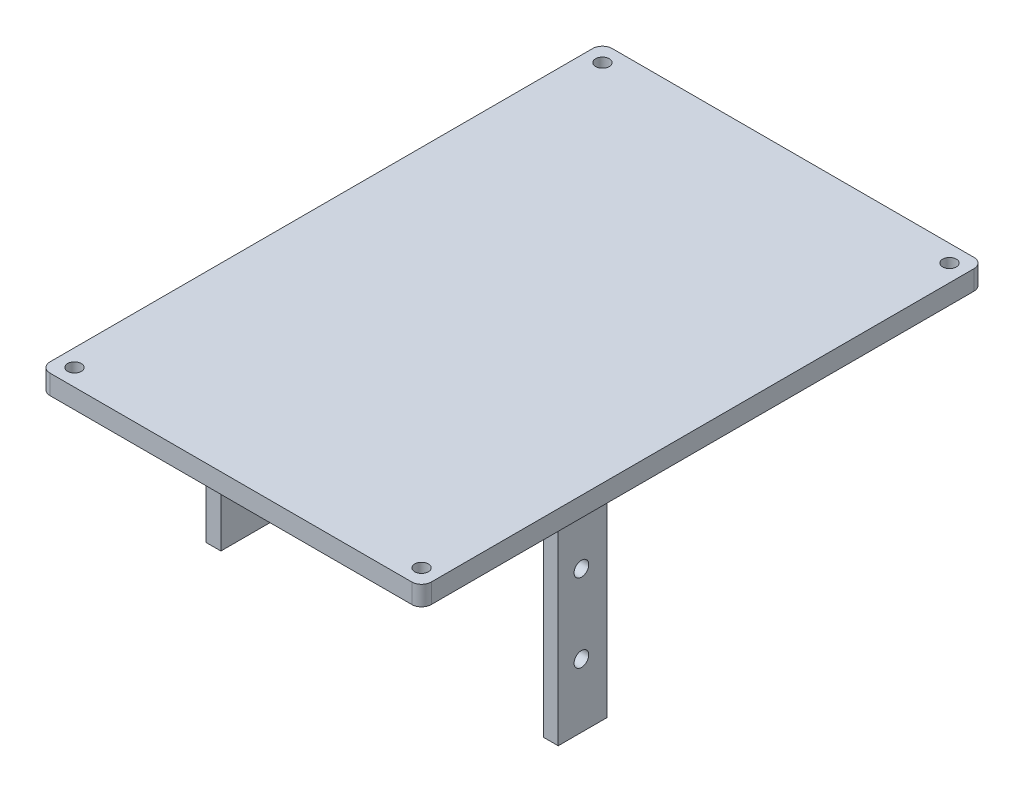
ISO-10303-21;
HEADER;
FILE_DESCRIPTION(('STEP AP214'),'2;1');
FILE_NAME('part.step','',(''),(''),'','','');
FILE_SCHEMA(('AUTOMOTIVE_DESIGN { 1 0 10303 214 1 1 1 1 }'));
ENDSEC;
DATA;
#1=APPLICATION_CONTEXT('core data for automotive mechanical design processes');
#2=APPLICATION_PROTOCOL_DEFINITION('international standard','automotive_design',2000,#1);
#3=PRODUCT_CONTEXT('',#1,'mechanical');
#4=PRODUCT('Part','Part','',(#3));
#5=PRODUCT_RELATED_PRODUCT_CATEGORY('part','',(#4));
#6=PRODUCT_DEFINITION_FORMATION('','',#4);
#7=PRODUCT_DEFINITION_CONTEXT('part definition',#1,'design');
#8=PRODUCT_DEFINITION('design','',#6,#7);
#9=PRODUCT_DEFINITION_SHAPE('','',#8);
#10=(LENGTH_UNIT() NAMED_UNIT(*) SI_UNIT(.MILLI.,.METRE.));
#11=(NAMED_UNIT(*) PLANE_ANGLE_UNIT() SI_UNIT($,.RADIAN.));
#12=(NAMED_UNIT(*) SI_UNIT($,.STERADIAN.) SOLID_ANGLE_UNIT());
#13=UNCERTAINTY_MEASURE_WITH_UNIT(LENGTH_MEASURE(1.E-05),#10,'distance_accuracy_value','');
#14=(GEOMETRIC_REPRESENTATION_CONTEXT(3) GLOBAL_UNCERTAINTY_ASSIGNED_CONTEXT((#13)) GLOBAL_UNIT_ASSIGNED_CONTEXT((#10,
#11,#12)) REPRESENTATION_CONTEXT('',''));
#15=CARTESIAN_POINT('',(0.,0.,0.));
#16=DIRECTION('',(0.,0.,1.));
#17=DIRECTION('',(1.,0.,0.));
#18=AXIS2_PLACEMENT_3D('',#15,#16,#17);
#19=CARTESIAN_POINT('',(0.,0.,0.));
#20=DIRECTION('',(0.,1.,0.));
#21=DIRECTION('',(0.,0.,1.));
#22=AXIS2_PLACEMENT_3D('',#19,#20,#21);
#23=PLANE('',#22);
#24=DIRECTION('',(0.,0.,-1.));
#25=VECTOR('',#24,1.);
#26=CARTESIAN_POINT('',(-36.,0.,26.55));
#27=LINE('',#26,#25);
#28=CARTESIAN_POINT('',(-36.,0.,26.55));
#29=VERTEX_POINT('',#28);
#30=CARTESIAN_POINT('',(-36.,0.,16.55));
#31=VERTEX_POINT('',#30);
#32=EDGE_CURVE('E172',#29,#31,#27,.T.);
#33=ORIENTED_EDGE('',*,*,#32,.F.);
#34=DIRECTION('',(-1.,0.,0.));
#35=VECTOR('',#34,1.);
#36=CARTESIAN_POINT('',(-36.,0.,26.55));
#37=LINE('',#36,#35);
#38=CARTESIAN_POINT('',(-33.,0.,26.55));
#39=VERTEX_POINT('',#38);
#40=EDGE_CURVE('E185',#39,#29,#37,.T.);
#41=ORIENTED_EDGE('',*,*,#40,.F.);
#42=DIRECTION('',(0.,0.,1.));
#43=VECTOR('',#42,1.);
#44=CARTESIAN_POINT('',(-33.,0.,26.55));
#45=LINE('',#44,#43);
#46=CARTESIAN_POINT('',(-33.,0.,16.55));
#47=VERTEX_POINT('',#46);
#48=EDGE_CURVE('E194',#47,#39,#45,.T.);
#49=ORIENTED_EDGE('',*,*,#48,.F.);
#50=DIRECTION('',(1.,0.,0.));
#51=VECTOR('',#50,1.);
#52=CARTESIAN_POINT('',(-36.,0.,16.55));
#53=LINE('',#52,#51);
#54=EDGE_CURVE('E175',#31,#47,#53,.T.);
#55=ORIENTED_EDGE('',*,*,#54,.F.);
#56=EDGE_LOOP('',(#33,#41,#49,#55));
#57=FACE_BOUND('',#56,.T.);
#58=DIRECTION('',(0.,0.,1.));
#59=VECTOR('',#58,1.);
#60=CARTESIAN_POINT('',(-39.,0.,57.5));
#61=LINE('',#60,#59);
#62=CARTESIAN_POINT('',(-39.,0.,-55.5));
#63=VERTEX_POINT('',#62);
#64=CARTESIAN_POINT('',(-39.,0.,55.5));
#65=VERTEX_POINT('',#64);
#66=EDGE_CURVE('E232',#63,#65,#61,.T.);
#67=ORIENTED_EDGE('',*,*,#66,.F.);
#68=CARTESIAN_POINT('',(-37.,0.,-55.5));
#69=DIRECTION('',(0.,1.,0.));
#70=DIRECTION('',(0.,0.,1.));
#71=AXIS2_PLACEMENT_3D('',#68,#69,#70);
#72=CIRCLE('',#71,2.);
#73=CARTESIAN_POINT('',(-37.,0.,-57.5));
#74=VERTEX_POINT('',#73);
#75=EDGE_CURVE('E266',#63,#74,#72,.F.);
#76=ORIENTED_EDGE('',*,*,#75,.T.);
#77=DIRECTION('',(-1.,0.,0.));
#78=VECTOR('',#77,1.);
#79=CARTESIAN_POINT('',(39.,0.,-57.5));
#80=LINE('',#79,#78);
#81=CARTESIAN_POINT('',(37.,0.,-57.5));
#82=VERTEX_POINT('',#81);
#83=EDGE_CURVE('E239',#82,#74,#80,.T.);
#84=ORIENTED_EDGE('',*,*,#83,.F.);
#85=CARTESIAN_POINT('',(37.,0.,-55.5));
#86=DIRECTION('',(0.,1.,0.));
#87=DIRECTION('',(0.,0.,1.));
#88=AXIS2_PLACEMENT_3D('',#85,#86,#87);
#89=CIRCLE('',#88,2.);
#90=CARTESIAN_POINT('',(39.,0.,-55.5));
#91=VERTEX_POINT('',#90);
#92=EDGE_CURVE('E260',#82,#91,#89,.F.);
#93=ORIENTED_EDGE('',*,*,#92,.T.);
#94=DIRECTION('',(0.,0.,-1.));
#95=VECTOR('',#94,1.);
#96=CARTESIAN_POINT('',(39.,0.,57.5));
#97=LINE('',#96,#95);
#98=CARTESIAN_POINT('',(39.,0.,55.5));
#99=VERTEX_POINT('',#98);
#100=EDGE_CURVE('E252',#99,#91,#97,.T.);
#101=ORIENTED_EDGE('',*,*,#100,.F.);
#102=CARTESIAN_POINT('',(37.,0.,55.5));
#103=DIRECTION('',(0.,1.,0.));
#104=DIRECTION('',(0.,0.,1.));
#105=AXIS2_PLACEMENT_3D('',#102,#103,#104);
#106=CIRCLE('',#105,2.);
#107=CARTESIAN_POINT('',(37.,0.,57.5));
#108=VERTEX_POINT('',#107);
#109=EDGE_CURVE('E262',#99,#108,#106,.F.);
#110=ORIENTED_EDGE('',*,*,#109,.T.);
#111=DIRECTION('',(1.,0.,0.));
#112=VECTOR('',#111,1.);
#113=CARTESIAN_POINT('',(39.,0.,57.5));
#114=LINE('',#113,#112);
#115=CARTESIAN_POINT('',(-37.,0.,57.5));
#116=VERTEX_POINT('',#115);
#117=EDGE_CURVE('E249',#116,#108,#114,.T.);
#118=ORIENTED_EDGE('',*,*,#117,.F.);
#119=CARTESIAN_POINT('',(-37.,0.,55.5));
#120=DIRECTION('',(0.,1.,0.));
#121=DIRECTION('',(0.,0.,1.));
#122=AXIS2_PLACEMENT_3D('',#119,#120,#121);
#123=CIRCLE('',#122,2.);
#124=EDGE_CURVE('E264',#116,#65,#123,.F.);
#125=ORIENTED_EDGE('',*,*,#124,.T.);
#126=EDGE_LOOP('',(#67,#76,#84,#93,#101,#110,#118,#125));
#127=FACE_BOUND('',#126,.T.);
#128=DIRECTION('',(-1.,0.,0.));
#129=VECTOR('',#128,1.);
#130=CARTESIAN_POINT('',(36.,0.,26.55));
#131=LINE('',#130,#129);
#132=CARTESIAN_POINT('',(36.,0.,26.55));
#133=VERTEX_POINT('',#132);
#134=CARTESIAN_POINT('',(33.,0.,26.55));
#135=VERTEX_POINT('',#134);
#136=EDGE_CURVE('E171',#133,#135,#131,.T.);
#137=ORIENTED_EDGE('',*,*,#136,.F.);
#138=DIRECTION('',(0.,0.,1.));
#139=VECTOR('',#138,1.);
#140=CARTESIAN_POINT('',(36.,0.,26.55));
#141=LINE('',#140,#139);
#142=CARTESIAN_POINT('',(36.,0.,16.55));
#143=VERTEX_POINT('',#142);
#144=EDGE_CURVE('E168',#143,#133,#141,.T.);
#145=ORIENTED_EDGE('',*,*,#144,.F.);
#146=DIRECTION('',(1.,0.,0.));
#147=VECTOR('',#146,1.);
#148=CARTESIAN_POINT('',(36.,0.,16.55));
#149=LINE('',#148,#147);
#150=CARTESIAN_POINT('',(33.,0.,16.55));
#151=VERTEX_POINT('',#150);
#152=EDGE_CURVE('E629',#151,#143,#149,.T.);
#153=ORIENTED_EDGE('',*,*,#152,.F.);
#154=DIRECTION('',(0.,0.,-1.));
#155=VECTOR('',#154,1.);
#156=CARTESIAN_POINT('',(33.,0.,26.55));
#157=LINE('',#156,#155);
#158=EDGE_CURVE('E619',#135,#151,#157,.T.);
#159=ORIENTED_EDGE('',*,*,#158,.F.);
#160=EDGE_LOOP('',(#137,#145,#153,#159));
#161=FACE_BOUND('',#160,.T.);
#162=ADVANCED_FACE('F33',(#57,#127,#161),#23,.F.);
#163=CARTESIAN_POINT('',(-39.,4.,57.5));
#164=DIRECTION('',(1.,0.,0.));
#165=DIRECTION('',(0.,0.,-1.));
#166=AXIS2_PLACEMENT_3D('',#163,#164,#165);
#167=PLANE('',#166);
#168=DIRECTION('',(0.,0.,1.));
#169=VECTOR('',#168,1.);
#170=CARTESIAN_POINT('',(-39.,4.,57.5));
#171=LINE('',#170,#169);
#172=CARTESIAN_POINT('',(-39.,4.,-55.5));
#173=VERTEX_POINT('',#172);
#174=CARTESIAN_POINT('',(-39.,4.,55.5));
#175=VERTEX_POINT('',#174);
#176=EDGE_CURVE('E235',#173,#175,#171,.T.);
#177=ORIENTED_EDGE('',*,*,#176,.F.);
#178=DIRECTION('',(0.,-1.,0.));
#179=VECTOR('',#178,1.);
#180=CARTESIAN_POINT('',(-39.,4.,-55.5));
#181=LINE('',#180,#179);
#182=EDGE_CURVE('E257',#173,#63,#181,.T.);
#183=ORIENTED_EDGE('',*,*,#182,.T.);
#184=ORIENTED_EDGE('',*,*,#66,.T.);
#185=DIRECTION('',(0.,-1.,0.));
#186=VECTOR('',#185,1.);
#187=CARTESIAN_POINT('',(-39.,4.,55.5));
#188=LINE('',#187,#186);
#189=EDGE_CURVE('E246',#65,#175,#188,.F.);
#190=ORIENTED_EDGE('',*,*,#189,.T.);
#191=EDGE_LOOP('',(#177,#183,#184,#190));
#192=FACE_BOUND('',#191,.T.);
#193=ADVANCED_FACE('F315',(#192),#167,.F.);
#194=CARTESIAN_POINT('',(39.,4.,57.5));
#195=DIRECTION('',(0.,0.,-1.));
#196=DIRECTION('',(-1.,0.,0.));
#197=AXIS2_PLACEMENT_3D('',#194,#195,#196);
#198=PLANE('',#197);
#199=DIRECTION('',(1.,0.,0.));
#200=VECTOR('',#199,1.);
#201=CARTESIAN_POINT('',(39.,4.,57.5));
#202=LINE('',#201,#200);
#203=CARTESIAN_POINT('',(-37.,4.,57.5));
#204=VERTEX_POINT('',#203);
#205=CARTESIAN_POINT('',(37.,4.,57.5));
#206=VERTEX_POINT('',#205);
#207=EDGE_CURVE('E238',#204,#206,#202,.T.);
#208=ORIENTED_EDGE('',*,*,#207,.F.);
#209=DIRECTION('',(0.,-1.,0.));
#210=VECTOR('',#209,1.);
#211=CARTESIAN_POINT('',(-37.,4.,57.5));
#212=LINE('',#211,#210);
#213=EDGE_CURVE('E282',#204,#116,#212,.T.);
#214=ORIENTED_EDGE('',*,*,#213,.T.);
#215=ORIENTED_EDGE('',*,*,#117,.T.);
#216=DIRECTION('',(0.,-1.,0.));
#217=VECTOR('',#216,1.);
#218=CARTESIAN_POINT('',(37.,4.,57.5));
#219=LINE('',#218,#217);
#220=EDGE_CURVE('E280',#108,#206,#219,.F.);
#221=ORIENTED_EDGE('',*,*,#220,.T.);
#222=EDGE_LOOP('',(#208,#214,#215,#221));
#223=FACE_BOUND('',#222,.T.);
#224=ADVANCED_FACE('F288',(#223),#198,.F.);
#225=CARTESIAN_POINT('',(39.,4.,57.5));
#226=DIRECTION('',(-1.,0.,0.));
#227=DIRECTION('',(0.,0.,1.));
#228=AXIS2_PLACEMENT_3D('',#225,#226,#227);
#229=PLANE('',#228);
#230=DIRECTION('',(0.,0.,-1.));
#231=VECTOR('',#230,1.);
#232=CARTESIAN_POINT('',(39.,4.,57.5));
#233=LINE('',#232,#231);
#234=CARTESIAN_POINT('',(39.,4.,55.5));
#235=VERTEX_POINT('',#234);
#236=CARTESIAN_POINT('',(39.,4.,-55.5));
#237=VERTEX_POINT('',#236);
#238=EDGE_CURVE('E241',#235,#237,#233,.T.);
#239=ORIENTED_EDGE('',*,*,#238,.F.);
#240=DIRECTION('',(0.,-1.,0.));
#241=VECTOR('',#240,1.);
#242=CARTESIAN_POINT('',(39.,4.,55.5));
#243=LINE('',#242,#241);
#244=EDGE_CURVE('E11',#235,#99,#243,.T.);
#245=ORIENTED_EDGE('',*,*,#244,.T.);
#246=ORIENTED_EDGE('',*,*,#100,.T.);
#247=DIRECTION('',(0.,-1.,0.));
#248=VECTOR('',#247,1.);
#249=CARTESIAN_POINT('',(39.,4.,-55.5));
#250=LINE('',#249,#248);
#251=EDGE_CURVE('E41',#91,#237,#250,.F.);
#252=ORIENTED_EDGE('',*,*,#251,.T.);
#253=EDGE_LOOP('',(#239,#245,#246,#252));
#254=FACE_BOUND('',#253,.T.);
#255=ADVANCED_FACE('F299',(#254),#229,.F.);
#256=CARTESIAN_POINT('',(39.,4.,-57.5));
#257=DIRECTION('',(0.,0.,1.));
#258=DIRECTION('',(1.,0.,0.));
#259=AXIS2_PLACEMENT_3D('',#256,#257,#258);
#260=PLANE('',#259);
#261=ORIENTED_EDGE('',*,*,#83,.T.);
#262=DIRECTION('',(0.,-1.,0.));
#263=VECTOR('',#262,1.);
#264=CARTESIAN_POINT('',(-37.,4.,-57.5));
#265=LINE('',#264,#263);
#266=CARTESIAN_POINT('',(-37.,4.,-57.5));
#267=VERTEX_POINT('',#266);
#268=EDGE_CURVE('E271',#74,#267,#265,.F.);
#269=ORIENTED_EDGE('',*,*,#268,.T.);
#270=DIRECTION('',(-1.,0.,0.));
#271=VECTOR('',#270,1.);
#272=CARTESIAN_POINT('',(39.,4.,-57.5));
#273=LINE('',#272,#271);
#274=CARTESIAN_POINT('',(37.,4.,-57.5));
#275=VERTEX_POINT('',#274);
#276=EDGE_CURVE('E243',#275,#267,#273,.T.);
#277=ORIENTED_EDGE('',*,*,#276,.F.);
#278=DIRECTION('',(0.,-1.,0.));
#279=VECTOR('',#278,1.);
#280=CARTESIAN_POINT('',(37.,4.,-57.5));
#281=LINE('',#280,#279);
#282=EDGE_CURVE('E268',#275,#82,#281,.T.);
#283=ORIENTED_EDGE('',*,*,#282,.T.);
#284=EDGE_LOOP('',(#261,#269,#277,#283));
#285=FACE_BOUND('',#284,.T.);
#286=ADVANCED_FACE('F307',(#285),#260,.F.);
#287=CARTESIAN_POINT('',(0.,4.,0.));
#288=DIRECTION('',(0.,1.,0.));
#289=DIRECTION('',(0.,0.,1.));
#290=AXIS2_PLACEMENT_3D('',#287,#288,#289);
#291=PLANE('',#290);
#292=CARTESIAN_POINT('',(-35.5,4.,54.));
#293=DIRECTION('',(0.,1.,0.));
#294=DIRECTION('',(0.,0.,-1.));
#295=AXIS2_PLACEMENT_3D('',#292,#293,#294);
#296=CIRCLE('',#295,1.4);
#297=CARTESIAN_POINT('',(-35.5,4.,52.6));
#298=VERTEX_POINT('',#297);
#299=EDGE_CURVE('E210',#298,#298,#296,.T.);
#300=ORIENTED_EDGE('',*,*,#299,.F.);
#301=EDGE_LOOP('',(#300));
#302=FACE_BOUND('',#301,.T.);
#303=CARTESIAN_POINT('',(35.5,4.,54.));
#304=DIRECTION('',(0.,1.,0.));
#305=DIRECTION('',(0.,0.,-1.));
#306=AXIS2_PLACEMENT_3D('',#303,#304,#305);
#307=CIRCLE('',#306,1.4);
#308=CARTESIAN_POINT('',(35.5,4.,52.6));
#309=VERTEX_POINT('',#308);
#310=EDGE_CURVE('E221',#309,#309,#307,.T.);
#311=ORIENTED_EDGE('',*,*,#310,.F.);
#312=EDGE_LOOP('',(#311));
#313=FACE_BOUND('',#312,.T.);
#314=CARTESIAN_POINT('',(35.5,4.,-54.));
#315=DIRECTION('',(0.,1.,0.));
#316=DIRECTION('',(0.,0.,1.));
#317=AXIS2_PLACEMENT_3D('',#314,#315,#316);
#318=CIRCLE('',#317,1.4);
#319=CARTESIAN_POINT('',(35.5,4.,-52.6));
#320=VERTEX_POINT('',#319);
#321=EDGE_CURVE('E215',#320,#320,#318,.T.);
#322=ORIENTED_EDGE('',*,*,#321,.F.);
#323=EDGE_LOOP('',(#322));
#324=FACE_BOUND('',#323,.T.);
#325=CARTESIAN_POINT('',(-35.5,4.,-54.));
#326=DIRECTION('',(0.,1.,0.));
#327=DIRECTION('',(0.,0.,1.));
#328=AXIS2_PLACEMENT_3D('',#325,#326,#327);
#329=CIRCLE('',#328,1.4);
#330=CARTESIAN_POINT('',(-35.5,4.,-52.6));
#331=VERTEX_POINT('',#330);
#332=EDGE_CURVE('E214',#331,#331,#329,.T.);
#333=ORIENTED_EDGE('',*,*,#332,.F.);
#334=EDGE_LOOP('',(#333));
#335=FACE_BOUND('',#334,.T.);
#336=ORIENTED_EDGE('',*,*,#276,.T.);
#337=CARTESIAN_POINT('',(-37.,4.,-55.5));
#338=DIRECTION('',(0.,1.,0.));
#339=DIRECTION('',(0.,0.,1.));
#340=AXIS2_PLACEMENT_3D('',#337,#338,#339);
#341=CIRCLE('',#340,2.);
#342=EDGE_CURVE('E278',#267,#173,#341,.T.);
#343=ORIENTED_EDGE('',*,*,#342,.T.);
#344=ORIENTED_EDGE('',*,*,#176,.T.);
#345=CARTESIAN_POINT('',(-37.,4.,55.5));
#346=DIRECTION('',(0.,1.,0.));
#347=DIRECTION('',(0.,0.,1.));
#348=AXIS2_PLACEMENT_3D('',#345,#346,#347);
#349=CIRCLE('',#348,2.);
#350=EDGE_CURVE('E276',#175,#204,#349,.T.);
#351=ORIENTED_EDGE('',*,*,#350,.T.);
#352=ORIENTED_EDGE('',*,*,#207,.T.);
#353=CARTESIAN_POINT('',(37.,4.,55.5));
#354=DIRECTION('',(0.,1.,0.));
#355=DIRECTION('',(0.,0.,1.));
#356=AXIS2_PLACEMENT_3D('',#353,#354,#355);
#357=CIRCLE('',#356,2.);
#358=EDGE_CURVE('E54',#206,#235,#357,.T.);
#359=ORIENTED_EDGE('',*,*,#358,.T.);
#360=ORIENTED_EDGE('',*,*,#238,.T.);
#361=CARTESIAN_POINT('',(37.,4.,-55.5));
#362=DIRECTION('',(0.,1.,0.));
#363=DIRECTION('',(0.,0.,1.));
#364=AXIS2_PLACEMENT_3D('',#361,#362,#363);
#365=CIRCLE('',#364,2.);
#366=EDGE_CURVE('E273',#237,#275,#365,.T.);
#367=ORIENTED_EDGE('',*,*,#366,.T.);
#368=EDGE_LOOP('',(#336,#343,#344,#351,#352,#359,#360,#367));
#369=FACE_BOUND('',#368,.T.);
#370=ADVANCED_FACE('F301',(#302,#313,#324,#335,#369),#291,.T.);
#371=CARTESIAN_POINT('',(-35.5,2.,-54.));
#372=DIRECTION('',(0.,1.,0.));
#373=DIRECTION('',(0.,0.,1.));
#374=AXIS2_PLACEMENT_3D('',#371,#372,#373);
#375=CYLINDRICAL_SURFACE('',#374,1.4);
#376=CARTESIAN_POINT('',(-35.5,2.,-54.));
#377=DIRECTION('',(0.,1.,0.));
#378=DIRECTION('',(0.,0.,1.));
#379=AXIS2_PLACEMENT_3D('',#376,#377,#378);
#380=CIRCLE('',#379,1.4);
#381=CARTESIAN_POINT('',(-35.5,2.,-52.6));
#382=VERTEX_POINT('',#381);
#383=EDGE_CURVE('E229',#382,#382,#380,.T.);
#384=ORIENTED_EDGE('',*,*,#383,.F.);
#385=EDGE_LOOP('',(#384));
#386=FACE_BOUND('',#385,.T.);
#387=ORIENTED_EDGE('',*,*,#332,.T.);
#388=EDGE_LOOP('',(#387));
#389=FACE_BOUND('',#388,.T.);
#390=ADVANCED_FACE('F359',(#386,#389),#375,.F.);
#391=CARTESIAN_POINT('',(-35.5,2.,-54.));
#392=DIRECTION('',(0.,1.,0.));
#393=DIRECTION('',(0.,0.,1.));
#394=AXIS2_PLACEMENT_3D('',#391,#392,#393);
#395=PLANE('',#394);
#396=ORIENTED_EDGE('',*,*,#383,.T.);
#397=EDGE_LOOP('',(#396));
#398=FACE_BOUND('',#397,.T.);
#399=ADVANCED_FACE('F367',(#398),#395,.T.);
#400=CARTESIAN_POINT('',(35.5,2.,-54.));
#401=DIRECTION('',(0.,1.,0.));
#402=DIRECTION('',(0.,0.,1.));
#403=AXIS2_PLACEMENT_3D('',#400,#401,#402);
#404=CYLINDRICAL_SURFACE('',#403,1.4);
#405=CARTESIAN_POINT('',(35.5,2.,-54.));
#406=DIRECTION('',(0.,1.,0.));
#407=DIRECTION('',(0.,0.,1.));
#408=AXIS2_PLACEMENT_3D('',#405,#406,#407);
#409=CIRCLE('',#408,1.4);
#410=CARTESIAN_POINT('',(35.5,2.,-52.6));
#411=VERTEX_POINT('',#410);
#412=EDGE_CURVE('E211',#411,#411,#409,.T.);
#413=ORIENTED_EDGE('',*,*,#412,.F.);
#414=EDGE_LOOP('',(#413));
#415=FACE_BOUND('',#414,.T.);
#416=ORIENTED_EDGE('',*,*,#321,.T.);
#417=EDGE_LOOP('',(#416));
#418=FACE_BOUND('',#417,.T.);
#419=ADVANCED_FACE('F374',(#415,#418),#404,.F.);
#420=CARTESIAN_POINT('',(35.5,2.,-54.));
#421=DIRECTION('',(0.,1.,0.));
#422=DIRECTION('',(0.,0.,1.));
#423=AXIS2_PLACEMENT_3D('',#420,#421,#422);
#424=PLANE('',#423);
#425=ORIENTED_EDGE('',*,*,#412,.T.);
#426=EDGE_LOOP('',(#425));
#427=FACE_BOUND('',#426,.T.);
#428=ADVANCED_FACE('F382',(#427),#424,.T.);
#429=CARTESIAN_POINT('',(35.5,2.,54.));
#430=DIRECTION('',(0.,1.,0.));
#431=DIRECTION('',(0.,0.,1.));
#432=AXIS2_PLACEMENT_3D('',#429,#430,#431);
#433=CYLINDRICAL_SURFACE('',#432,1.4);
#434=CARTESIAN_POINT('',(35.5,2.,54.));
#435=DIRECTION('',(0.,1.,0.));
#436=DIRECTION('',(0.,0.,-1.));
#437=AXIS2_PLACEMENT_3D('',#434,#435,#436);
#438=CIRCLE('',#437,1.4);
#439=CARTESIAN_POINT('',(35.5,2.,52.6));
#440=VERTEX_POINT('',#439);
#441=EDGE_CURVE('E218',#440,#440,#438,.T.);
#442=ORIENTED_EDGE('',*,*,#441,.F.);
#443=EDGE_LOOP('',(#442));
#444=FACE_BOUND('',#443,.T.);
#445=ORIENTED_EDGE('',*,*,#310,.T.);
#446=EDGE_LOOP('',(#445));
#447=FACE_BOUND('',#446,.T.);
#448=ADVANCED_FACE('F390',(#444,#447),#433,.F.);
#449=CARTESIAN_POINT('',(35.5,2.,54.));
#450=DIRECTION('',(0.,-1.,0.));
#451=DIRECTION('',(0.,0.,-1.));
#452=AXIS2_PLACEMENT_3D('',#449,#450,#451);
#453=PLANE('',#452);
#454=ORIENTED_EDGE('',*,*,#441,.T.);
#455=EDGE_LOOP('',(#454));
#456=FACE_BOUND('',#455,.T.);
#457=ADVANCED_FACE('F398',(#456),#453,.F.);
#458=CARTESIAN_POINT('',(-35.5,2.,54.));
#459=DIRECTION('',(0.,1.,0.));
#460=DIRECTION('',(0.,0.,1.));
#461=AXIS2_PLACEMENT_3D('',#458,#459,#460);
#462=CYLINDRICAL_SURFACE('',#461,1.4);
#463=CARTESIAN_POINT('',(-35.5,2.,54.));
#464=DIRECTION('',(0.,1.,0.));
#465=DIRECTION('',(0.,0.,-1.));
#466=AXIS2_PLACEMENT_3D('',#463,#464,#465);
#467=CIRCLE('',#466,1.4);
#468=CARTESIAN_POINT('',(-35.5,2.,52.6));
#469=VERTEX_POINT('',#468);
#470=EDGE_CURVE('E224',#469,#469,#467,.T.);
#471=ORIENTED_EDGE('',*,*,#470,.F.);
#472=EDGE_LOOP('',(#471));
#473=FACE_BOUND('',#472,.T.);
#474=ORIENTED_EDGE('',*,*,#299,.T.);
#475=EDGE_LOOP('',(#474));
#476=FACE_BOUND('',#475,.T.);
#477=ADVANCED_FACE('F406',(#473,#476),#462,.F.);
#478=CARTESIAN_POINT('',(-35.5,2.,54.));
#479=DIRECTION('',(0.,-1.,0.));
#480=DIRECTION('',(0.,0.,-1.));
#481=AXIS2_PLACEMENT_3D('',#478,#479,#480);
#482=PLANE('',#481);
#483=ORIENTED_EDGE('',*,*,#470,.T.);
#484=EDGE_LOOP('',(#483));
#485=FACE_BOUND('',#484,.T.);
#486=ADVANCED_FACE('F414',(#485),#482,.F.);
#487=CARTESIAN_POINT('',(-36.,-41.,26.55));
#488=DIRECTION('',(1.,0.,0.));
#489=DIRECTION('',(0.,0.,-1.));
#490=AXIS2_PLACEMENT_3D('',#487,#488,#489);
#491=PLANE('',#490);
#492=CARTESIAN_POINT('',(-36.,-12.,21.8));
#493=DIRECTION('',(1.,0.,0.));
#494=DIRECTION('',(0.,0.,-1.));
#495=AXIS2_PLACEMENT_3D('',#492,#493,#494);
#496=CIRCLE('',#495,1.5);
#497=CARTESIAN_POINT('',(-36.,-12.,20.3));
#498=VERTEX_POINT('',#497);
#499=EDGE_CURVE('E617',#498,#498,#496,.T.);
#500=ORIENTED_EDGE('',*,*,#499,.T.);
#501=EDGE_LOOP('',(#500));
#502=FACE_BOUND('',#501,.T.);
#503=CARTESIAN_POINT('',(-36.,-28.,21.8));
#504=DIRECTION('',(1.,0.,0.));
#505=DIRECTION('',(0.,0.,-1.));
#506=AXIS2_PLACEMENT_3D('',#503,#504,#505);
#507=CIRCLE('',#506,1.5);
#508=CARTESIAN_POINT('',(-36.,-28.,20.3));
#509=VERTEX_POINT('',#508);
#510=EDGE_CURVE('E639',#509,#509,#507,.T.);
#511=ORIENTED_EDGE('',*,*,#510,.T.);
#512=EDGE_LOOP('',(#511));
#513=FACE_BOUND('',#512,.T.);
#514=ORIENTED_EDGE('',*,*,#32,.T.);
#515=DIRECTION('',(0.,1.,0.));
#516=VECTOR('',#515,1.);
#517=CARTESIAN_POINT('',(-36.,-41.,16.55));
#518=LINE('',#517,#516);
#519=CARTESIAN_POINT('',(-36.,-41.,16.55));
#520=VERTEX_POINT('',#519);
#521=EDGE_CURVE('E207',#520,#31,#518,.T.);
#522=ORIENTED_EDGE('',*,*,#521,.F.);
#523=DIRECTION('',(0.,0.,-1.));
#524=VECTOR('',#523,1.);
#525=CARTESIAN_POINT('',(-36.,-41.,26.55));
#526=LINE('',#525,#524);
#527=CARTESIAN_POINT('',(-36.,-41.,26.55));
#528=VERTEX_POINT('',#527);
#529=EDGE_CURVE('E181',#528,#520,#526,.T.);
#530=ORIENTED_EDGE('',*,*,#529,.F.);
#531=DIRECTION('',(0.,1.,0.));
#532=VECTOR('',#531,1.);
#533=CARTESIAN_POINT('',(-36.,-41.,26.55));
#534=LINE('',#533,#532);
#535=EDGE_CURVE('E190',#528,#29,#534,.T.);
#536=ORIENTED_EDGE('',*,*,#535,.T.);
#537=EDGE_LOOP('',(#514,#522,#530,#536));
#538=FACE_BOUND('',#537,.T.);
#539=ADVANCED_FACE('F422',(#502,#513,#538),#491,.F.);
#540=CARTESIAN_POINT('',(-36.,-41.,16.55));
#541=DIRECTION('',(0.,0.,1.));
#542=DIRECTION('',(1.,0.,0.));
#543=AXIS2_PLACEMENT_3D('',#540,#541,#542);
#544=PLANE('',#543);
#545=ORIENTED_EDGE('',*,*,#54,.T.);
#546=DIRECTION('',(0.,1.,0.));
#547=VECTOR('',#546,1.);
#548=CARTESIAN_POINT('',(-33.,-41.,16.55));
#549=LINE('',#548,#547);
#550=CARTESIAN_POINT('',(-33.,-41.,16.55));
#551=VERTEX_POINT('',#550);
#552=EDGE_CURVE('E204',#551,#47,#549,.T.);
#553=ORIENTED_EDGE('',*,*,#552,.F.);
#554=DIRECTION('',(1.,0.,0.));
#555=VECTOR('',#554,1.);
#556=CARTESIAN_POINT('',(-36.,-41.,16.55));
#557=LINE('',#556,#555);
#558=EDGE_CURVE('E184',#520,#551,#557,.T.);
#559=ORIENTED_EDGE('',*,*,#558,.F.);
#560=ORIENTED_EDGE('',*,*,#521,.T.);
#561=EDGE_LOOP('',(#545,#553,#559,#560));
#562=FACE_BOUND('',#561,.T.);
#563=ADVANCED_FACE('F431',(#562),#544,.F.);
#564=CARTESIAN_POINT('',(-33.,-41.,26.55));
#565=DIRECTION('',(-1.,0.,0.));
#566=DIRECTION('',(0.,0.,1.));
#567=AXIS2_PLACEMENT_3D('',#564,#565,#566);
#568=PLANE('',#567);
#569=CARTESIAN_POINT('',(-33.,-12.,21.8));
#570=DIRECTION('',(-1.,0.,0.));
#571=DIRECTION('',(0.,0.,1.));
#572=AXIS2_PLACEMENT_3D('',#569,#570,#571);
#573=CIRCLE('',#572,1.5);
#574=CARTESIAN_POINT('',(-33.,-12.,23.3));
#575=VERTEX_POINT('',#574);
#576=EDGE_CURVE('E614',#575,#575,#573,.T.);
#577=ORIENTED_EDGE('',*,*,#576,.T.);
#578=EDGE_LOOP('',(#577));
#579=FACE_BOUND('',#578,.T.);
#580=CARTESIAN_POINT('',(-33.,-28.,21.8));
#581=DIRECTION('',(-1.,0.,0.));
#582=DIRECTION('',(0.,0.,1.));
#583=AXIS2_PLACEMENT_3D('',#580,#581,#582);
#584=CIRCLE('',#583,1.5);
#585=CARTESIAN_POINT('',(-33.,-28.,23.3));
#586=VERTEX_POINT('',#585);
#587=EDGE_CURVE('E642',#586,#586,#584,.T.);
#588=ORIENTED_EDGE('',*,*,#587,.T.);
#589=EDGE_LOOP('',(#588));
#590=FACE_BOUND('',#589,.T.);
#591=ORIENTED_EDGE('',*,*,#48,.T.);
#592=DIRECTION('',(0.,1.,0.));
#593=VECTOR('',#592,1.);
#594=CARTESIAN_POINT('',(-33.,-41.,26.55));
#595=LINE('',#594,#593);
#596=CARTESIAN_POINT('',(-33.,-41.,26.55));
#597=VERTEX_POINT('',#596);
#598=EDGE_CURVE('E201',#597,#39,#595,.T.);
#599=ORIENTED_EDGE('',*,*,#598,.F.);
#600=DIRECTION('',(0.,0.,1.));
#601=VECTOR('',#600,1.);
#602=CARTESIAN_POINT('',(-33.,-41.,26.55));
#603=LINE('',#602,#601);
#604=EDGE_CURVE('E187',#551,#597,#603,.T.);
#605=ORIENTED_EDGE('',*,*,#604,.F.);
#606=ORIENTED_EDGE('',*,*,#552,.T.);
#607=EDGE_LOOP('',(#591,#599,#605,#606));
#608=FACE_BOUND('',#607,.T.);
#609=ADVANCED_FACE('F440',(#579,#590,#608),#568,.F.);
#610=CARTESIAN_POINT('',(-36.,-41.,26.55));
#611=DIRECTION('',(0.,0.,-1.));
#612=DIRECTION('',(-1.,0.,0.));
#613=AXIS2_PLACEMENT_3D('',#610,#611,#612);
#614=PLANE('',#613);
#615=ORIENTED_EDGE('',*,*,#40,.T.);
#616=ORIENTED_EDGE('',*,*,#535,.F.);
#617=DIRECTION('',(-1.,0.,0.));
#618=VECTOR('',#617,1.);
#619=CARTESIAN_POINT('',(-36.,-41.,26.55));
#620=LINE('',#619,#618);
#621=EDGE_CURVE('E189',#597,#528,#620,.T.);
#622=ORIENTED_EDGE('',*,*,#621,.F.);
#623=ORIENTED_EDGE('',*,*,#598,.T.);
#624=EDGE_LOOP('',(#615,#616,#622,#623));
#625=FACE_BOUND('',#624,.T.);
#626=ADVANCED_FACE('F448',(#625),#614,.F.);
#627=CARTESIAN_POINT('',(0.,-41.,0.));
#628=DIRECTION('',(0.,-1.,0.));
#629=DIRECTION('',(0.,0.,-1.));
#630=AXIS2_PLACEMENT_3D('',#627,#628,#629);
#631=PLANE('',#630);
#632=ORIENTED_EDGE('',*,*,#529,.T.);
#633=ORIENTED_EDGE('',*,*,#558,.T.);
#634=ORIENTED_EDGE('',*,*,#604,.T.);
#635=ORIENTED_EDGE('',*,*,#621,.T.);
#636=EDGE_LOOP('',(#632,#633,#634,#635));
#637=FACE_BOUND('',#636,.T.);
#638=ADVANCED_FACE('F456',(#637),#631,.T.);
#639=CARTESIAN_POINT('',(36.,-41.,26.55));
#640=DIRECTION('',(0.,0.,-1.));
#641=DIRECTION('',(-1.,0.,0.));
#642=AXIS2_PLACEMENT_3D('',#639,#640,#641);
#643=PLANE('',#642);
#644=ORIENTED_EDGE('',*,*,#136,.T.);
#645=DIRECTION('',(0.,1.,0.));
#646=VECTOR('',#645,1.);
#647=CARTESIAN_POINT('',(33.,-41.,26.55));
#648=LINE('',#647,#646);
#649=CARTESIAN_POINT('',(33.,-41.,26.55));
#650=VERTEX_POINT('',#649);
#651=EDGE_CURVE('E152',#650,#135,#648,.T.);
#652=ORIENTED_EDGE('',*,*,#651,.F.);
#653=DIRECTION('',(-1.,0.,0.));
#654=VECTOR('',#653,1.);
#655=CARTESIAN_POINT('',(36.,-41.,26.55));
#656=LINE('',#655,#654);
#657=CARTESIAN_POINT('',(36.,-41.,26.55));
#658=VERTEX_POINT('',#657);
#659=EDGE_CURVE('E159',#658,#650,#656,.T.);
#660=ORIENTED_EDGE('',*,*,#659,.F.);
#661=DIRECTION('',(0.,1.,0.));
#662=VECTOR('',#661,1.);
#663=CARTESIAN_POINT('',(36.,-41.,26.55));
#664=LINE('',#663,#662);
#665=EDGE_CURVE('E626',#658,#133,#664,.T.);
#666=ORIENTED_EDGE('',*,*,#665,.T.);
#667=EDGE_LOOP('',(#644,#652,#660,#666));
#668=FACE_BOUND('',#667,.T.);
#669=ADVANCED_FACE('F170',(#668),#643,.F.);
#670=CARTESIAN_POINT('',(33.,-41.,26.55));
#671=DIRECTION('',(1.,0.,0.));
#672=DIRECTION('',(0.,0.,-1.));
#673=AXIS2_PLACEMENT_3D('',#670,#671,#672);
#674=PLANE('',#673);
#675=CARTESIAN_POINT('',(33.,-12.,21.8));
#676=DIRECTION('',(1.,0.,0.));
#677=DIRECTION('',(0.,0.,-1.));
#678=AXIS2_PLACEMENT_3D('',#675,#676,#677);
#679=CIRCLE('',#678,1.5);
#680=CARTESIAN_POINT('',(33.,-12.,20.3));
#681=VERTEX_POINT('',#680);
#682=EDGE_CURVE('E621',#681,#681,#679,.T.);
#683=ORIENTED_EDGE('',*,*,#682,.T.);
#684=EDGE_LOOP('',(#683));
#685=FACE_BOUND('',#684,.T.);
#686=CARTESIAN_POINT('',(33.,-28.,21.8));
#687=DIRECTION('',(1.,0.,0.));
#688=DIRECTION('',(0.,0.,-1.));
#689=AXIS2_PLACEMENT_3D('',#686,#687,#688);
#690=CIRCLE('',#689,1.5);
#691=CARTESIAN_POINT('',(33.,-28.,20.3));
#692=VERTEX_POINT('',#691);
#693=EDGE_CURVE('E645',#692,#692,#690,.T.);
#694=ORIENTED_EDGE('',*,*,#693,.T.);
#695=EDGE_LOOP('',(#694));
#696=FACE_BOUND('',#695,.T.);
#697=ORIENTED_EDGE('',*,*,#158,.T.);
#698=DIRECTION('',(0.,1.,0.));
#699=VECTOR('',#698,1.);
#700=CARTESIAN_POINT('',(33.,-41.,16.55));
#701=LINE('',#700,#699);
#702=CARTESIAN_POINT('',(33.,-41.,16.55));
#703=VERTEX_POINT('',#702);
#704=EDGE_CURVE('E155',#703,#151,#701,.T.);
#705=ORIENTED_EDGE('',*,*,#704,.F.);
#706=DIRECTION('',(0.,0.,-1.));
#707=VECTOR('',#706,1.);
#708=CARTESIAN_POINT('',(33.,-41.,26.55));
#709=LINE('',#708,#707);
#710=EDGE_CURVE('E147',#650,#703,#709,.T.);
#711=ORIENTED_EDGE('',*,*,#710,.F.);
#712=ORIENTED_EDGE('',*,*,#651,.T.);
#713=EDGE_LOOP('',(#697,#705,#711,#712));
#714=FACE_BOUND('',#713,.T.);
#715=ADVANCED_FACE('F150',(#685,#696,#714),#674,.F.);
#716=CARTESIAN_POINT('',(36.,-41.,16.55));
#717=DIRECTION('',(0.,0.,1.));
#718=DIRECTION('',(1.,0.,0.));
#719=AXIS2_PLACEMENT_3D('',#716,#717,#718);
#720=PLANE('',#719);
#721=ORIENTED_EDGE('',*,*,#152,.T.);
#722=DIRECTION('',(0.,1.,0.));
#723=VECTOR('',#722,1.);
#724=CARTESIAN_POINT('',(36.,-41.,16.55));
#725=LINE('',#724,#723);
#726=CARTESIAN_POINT('',(36.,-41.,16.55));
#727=VERTEX_POINT('',#726);
#728=EDGE_CURVE('E177',#727,#143,#725,.T.);
#729=ORIENTED_EDGE('',*,*,#728,.F.);
#730=DIRECTION('',(1.,0.,0.));
#731=VECTOR('',#730,1.);
#732=CARTESIAN_POINT('',(36.,-41.,16.55));
#733=LINE('',#732,#731);
#734=EDGE_CURVE('E158',#703,#727,#733,.T.);
#735=ORIENTED_EDGE('',*,*,#734,.F.);
#736=ORIENTED_EDGE('',*,*,#704,.T.);
#737=EDGE_LOOP('',(#721,#729,#735,#736));
#738=FACE_BOUND('',#737,.T.);
#739=ADVANCED_FACE('F477',(#738),#720,.F.);
#740=CARTESIAN_POINT('',(36.,-41.,26.55));
#741=DIRECTION('',(-1.,0.,0.));
#742=DIRECTION('',(0.,0.,1.));
#743=AXIS2_PLACEMENT_3D('',#740,#741,#742);
#744=PLANE('',#743);
#745=CARTESIAN_POINT('',(36.,-12.,21.8));
#746=DIRECTION('',(1.,0.,0.));
#747=DIRECTION('',(0.,0.,-1.));
#748=AXIS2_PLACEMENT_3D('',#745,#746,#747);
#749=CIRCLE('',#748,1.5);
#750=CARTESIAN_POINT('',(36.,-12.,20.3));
#751=VERTEX_POINT('',#750);
#752=EDGE_CURVE('E648',#751,#751,#749,.T.);
#753=ORIENTED_EDGE('',*,*,#752,.F.);
#754=EDGE_LOOP('',(#753));
#755=FACE_BOUND('',#754,.T.);
#756=CARTESIAN_POINT('',(36.,-28.,21.8));
#757=DIRECTION('',(1.,0.,0.));
#758=DIRECTION('',(0.,0.,-1.));
#759=AXIS2_PLACEMENT_3D('',#756,#757,#758);
#760=CIRCLE('',#759,1.5);
#761=CARTESIAN_POINT('',(36.,-28.,20.3));
#762=VERTEX_POINT('',#761);
#763=EDGE_CURVE('E649',#762,#762,#760,.T.);
#764=ORIENTED_EDGE('',*,*,#763,.F.);
#765=EDGE_LOOP('',(#764));
#766=FACE_BOUND('',#765,.T.);
#767=ORIENTED_EDGE('',*,*,#144,.T.);
#768=ORIENTED_EDGE('',*,*,#665,.F.);
#769=DIRECTION('',(0.,0.,1.));
#770=VECTOR('',#769,1.);
#771=CARTESIAN_POINT('',(36.,-41.,26.55));
#772=LINE('',#771,#770);
#773=EDGE_CURVE('E164',#727,#658,#772,.T.);
#774=ORIENTED_EDGE('',*,*,#773,.F.);
#775=ORIENTED_EDGE('',*,*,#728,.T.);
#776=EDGE_LOOP('',(#767,#768,#774,#775));
#777=FACE_BOUND('',#776,.T.);
#778=ADVANCED_FACE('F485',(#755,#766,#777),#744,.F.);
#779=CARTESIAN_POINT('',(0.,-41.,0.));
#780=DIRECTION('',(0.,-1.,0.));
#781=DIRECTION('',(0.,0.,-1.));
#782=AXIS2_PLACEMENT_3D('',#779,#780,#781);
#783=PLANE('',#782);
#784=ORIENTED_EDGE('',*,*,#659,.T.);
#785=ORIENTED_EDGE('',*,*,#710,.T.);
#786=ORIENTED_EDGE('',*,*,#734,.T.);
#787=ORIENTED_EDGE('',*,*,#773,.T.);
#788=EDGE_LOOP('',(#784,#785,#786,#787));
#789=FACE_BOUND('',#788,.T.);
#790=ADVANCED_FACE('F162',(#789),#783,.T.);
#791=CARTESIAN_POINT('',(-39.,-28.,21.8));
#792=DIRECTION('',(1.,0.,0.));
#793=DIRECTION('',(0.,0.,-1.));
#794=AXIS2_PLACEMENT_3D('',#791,#792,#793);
#795=CYLINDRICAL_SURFACE('',#794,1.5);
#796=ORIENTED_EDGE('',*,*,#763,.T.);
#797=EDGE_LOOP('',(#796));
#798=FACE_BOUND('',#797,.T.);
#799=ORIENTED_EDGE('',*,*,#693,.F.);
#800=EDGE_LOOP('',(#799));
#801=FACE_BOUND('',#800,.T.);
#802=ADVANCED_FACE('F499',(#798,#801),#795,.F.);
#803=CARTESIAN_POINT('',(-39.,-12.,21.8));
#804=DIRECTION('',(1.,0.,0.));
#805=DIRECTION('',(0.,0.,-1.));
#806=AXIS2_PLACEMENT_3D('',#803,#804,#805);
#807=CYLINDRICAL_SURFACE('',#806,1.5);
#808=ORIENTED_EDGE('',*,*,#752,.T.);
#809=EDGE_LOOP('',(#808));
#810=FACE_BOUND('',#809,.T.);
#811=ORIENTED_EDGE('',*,*,#682,.F.);
#812=EDGE_LOOP('',(#811));
#813=FACE_BOUND('',#812,.T.);
#814=ADVANCED_FACE('F505',(#810,#813),#807,.F.);
#815=ORIENTED_EDGE('',*,*,#587,.F.);
#816=EDGE_LOOP('',(#815));
#817=FACE_BOUND('',#816,.T.);
#818=ORIENTED_EDGE('',*,*,#510,.F.);
#819=EDGE_LOOP('',(#818));
#820=FACE_BOUND('',#819,.T.);
#821=ADVANCED_FACE('F508',(#817,#820),#795,.F.);
#822=ORIENTED_EDGE('',*,*,#576,.F.);
#823=EDGE_LOOP('',(#822));
#824=FACE_BOUND('',#823,.T.);
#825=ORIENTED_EDGE('',*,*,#499,.F.);
#826=EDGE_LOOP('',(#825));
#827=FACE_BOUND('',#826,.T.);
#828=ADVANCED_FACE('F324',(#824,#827),#807,.F.);
#829=CARTESIAN_POINT('',(-37.,4.,-55.5));
#830=DIRECTION('',(0.,-1.,0.));
#831=DIRECTION('',(0.,0.,-1.));
#832=AXIS2_PLACEMENT_3D('',#829,#830,#831);
#833=CYLINDRICAL_SURFACE('',#832,2.);
#834=ORIENTED_EDGE('',*,*,#342,.F.);
#835=ORIENTED_EDGE('',*,*,#268,.F.);
#836=ORIENTED_EDGE('',*,*,#75,.F.);
#837=ORIENTED_EDGE('',*,*,#182,.F.);
#838=EDGE_LOOP('',(#834,#835,#836,#837));
#839=FACE_BOUND('',#838,.T.);
#840=ADVANCED_FACE('F312',(#839),#833,.T.);
#841=CARTESIAN_POINT('',(-37.,4.,55.5));
#842=DIRECTION('',(0.,-1.,0.));
#843=DIRECTION('',(0.,0.,-1.));
#844=AXIS2_PLACEMENT_3D('',#841,#842,#843);
#845=CYLINDRICAL_SURFACE('',#844,2.);
#846=ORIENTED_EDGE('',*,*,#350,.F.);
#847=ORIENTED_EDGE('',*,*,#189,.F.);
#848=ORIENTED_EDGE('',*,*,#124,.F.);
#849=ORIENTED_EDGE('',*,*,#213,.F.);
#850=EDGE_LOOP('',(#846,#847,#848,#849));
#851=FACE_BOUND('',#850,.T.);
#852=ADVANCED_FACE('F317',(#851),#845,.T.);
#853=CARTESIAN_POINT('',(37.,4.,55.5));
#854=DIRECTION('',(0.,-1.,0.));
#855=DIRECTION('',(0.,0.,-1.));
#856=AXIS2_PLACEMENT_3D('',#853,#854,#855);
#857=CYLINDRICAL_SURFACE('',#856,2.);
#858=ORIENTED_EDGE('',*,*,#358,.F.);
#859=ORIENTED_EDGE('',*,*,#220,.F.);
#860=ORIENTED_EDGE('',*,*,#109,.F.);
#861=ORIENTED_EDGE('',*,*,#244,.F.);
#862=EDGE_LOOP('',(#858,#859,#860,#861));
#863=FACE_BOUND('',#862,.T.);
#864=ADVANCED_FACE('F298',(#863),#857,.T.);
#865=CARTESIAN_POINT('',(37.,4.,-55.5));
#866=DIRECTION('',(0.,-1.,0.));
#867=DIRECTION('',(0.,0.,-1.));
#868=AXIS2_PLACEMENT_3D('',#865,#866,#867);
#869=CYLINDRICAL_SURFACE('',#868,2.);
#870=ORIENTED_EDGE('',*,*,#366,.F.);
#871=ORIENTED_EDGE('',*,*,#251,.F.);
#872=ORIENTED_EDGE('',*,*,#92,.F.);
#873=ORIENTED_EDGE('',*,*,#282,.F.);
#874=EDGE_LOOP('',(#870,#871,#872,#873));
#875=FACE_BOUND('',#874,.T.);
#876=ADVANCED_FACE('F35',(#875),#869,.T.);
#877=CLOSED_SHELL('',(#162,#193,#224,#255,#286,#370,#390,#399,#419,#428,#448,#457,#477,#486,
#539,#563,#609,#626,#638,#669,#715,#739,#778,#790,#802,#814,#821,#828,#840,#852,#864,#876));
#878=MANIFOLD_SOLID_BREP('B2',#877);
#879=ADVANCED_BREP_SHAPE_REPRESENTATION('',(#18,#878),#14);
#880=SHAPE_DEFINITION_REPRESENTATION(#9,#879);
ENDSEC;
END-ISO-10303-21;
